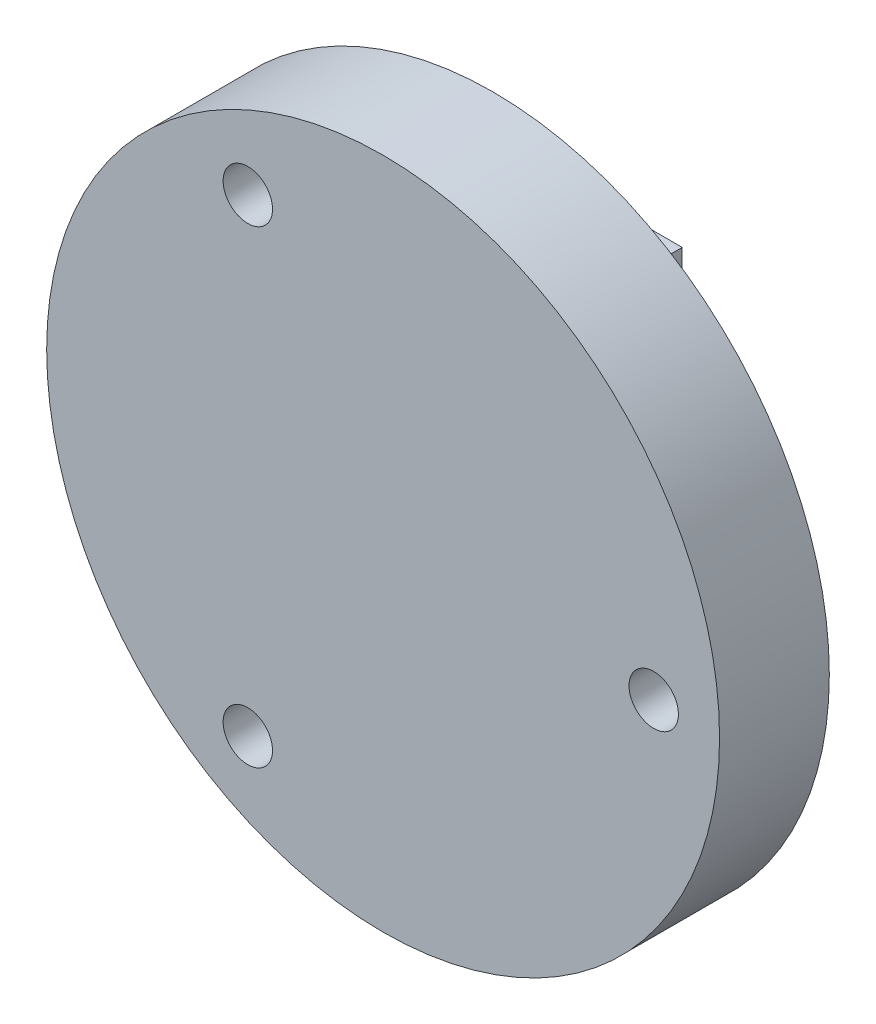
ISO-10303-21;
HEADER;
FILE_DESCRIPTION(('STEP AP214'),'2;1');
FILE_NAME('part.step','',(''),(''),'','','');
FILE_SCHEMA(('AUTOMOTIVE_DESIGN { 1 0 10303 214 1 1 1 1 }'));
ENDSEC;
DATA;
#1=APPLICATION_CONTEXT('core data for automotive mechanical design processes');
#2=APPLICATION_PROTOCOL_DEFINITION('international standard','automotive_design',2000,#1);
#3=PRODUCT_CONTEXT('',#1,'mechanical');
#4=PRODUCT('Part','Part','',(#3));
#5=PRODUCT_RELATED_PRODUCT_CATEGORY('part','',(#4));
#6=PRODUCT_DEFINITION_FORMATION('','',#4);
#7=PRODUCT_DEFINITION_CONTEXT('part definition',#1,'design');
#8=PRODUCT_DEFINITION('design','',#6,#7);
#9=PRODUCT_DEFINITION_SHAPE('','',#8);
#10=(LENGTH_UNIT() NAMED_UNIT(*) SI_UNIT(.MILLI.,.METRE.));
#11=(NAMED_UNIT(*) PLANE_ANGLE_UNIT() SI_UNIT($,.RADIAN.));
#12=(NAMED_UNIT(*) SI_UNIT($,.STERADIAN.) SOLID_ANGLE_UNIT());
#13=UNCERTAINTY_MEASURE_WITH_UNIT(LENGTH_MEASURE(1.E-05),#10,'distance_accuracy_value','');
#14=(GEOMETRIC_REPRESENTATION_CONTEXT(3) GLOBAL_UNCERTAINTY_ASSIGNED_CONTEXT((#13)) GLOBAL_UNIT_ASSIGNED_CONTEXT((#10,
#11,#12)) REPRESENTATION_CONTEXT('',''));
#15=CARTESIAN_POINT('',(0.,0.,0.));
#16=DIRECTION('',(0.,0.,1.));
#17=DIRECTION('',(1.,0.,0.));
#18=AXIS2_PLACEMENT_3D('',#15,#16,#17);
#19=CARTESIAN_POINT('',(-5.25,0.,-12.));
#20=DIRECTION('',(1.,0.,0.));
#21=DIRECTION('',(0.,0.,-1.));
#22=AXIS2_PLACEMENT_3D('',#19,#20,#21);
#23=PLANE('',#22);
#24=DIRECTION('',(0.,1.,0.));
#25=VECTOR('',#24,1.);
#26=CARTESIAN_POINT('',(-5.25,0.,0.));
#27=LINE('',#26,#25);
#28=CARTESIAN_POINT('',(-5.25,-15.,0.));
#29=VERTEX_POINT('',#28);
#30=CARTESIAN_POINT('',(-5.25,15.,0.));
#31=VERTEX_POINT('',#30);
#32=EDGE_CURVE('E108',#29,#31,#27,.T.);
#33=ORIENTED_EDGE('',*,*,#32,.T.);
#34=DIRECTION('',(0.,0.,1.));
#35=VECTOR('',#34,1.);
#36=CARTESIAN_POINT('',(-5.25,15.,-12.));
#37=LINE('',#36,#35);
#38=CARTESIAN_POINT('',(-5.25,15.,-12.));
#39=VERTEX_POINT('',#38);
#40=EDGE_CURVE('E98',#39,#31,#37,.T.);
#41=ORIENTED_EDGE('',*,*,#40,.F.);
#42=DIRECTION('',(0.,1.,0.));
#43=VECTOR('',#42,1.);
#44=CARTESIAN_POINT('',(-5.25,0.,-12.));
#45=LINE('',#44,#43);
#46=CARTESIAN_POINT('',(-5.25,-15.,-12.));
#47=VERTEX_POINT('',#46);
#48=EDGE_CURVE('E80',#47,#39,#45,.T.);
#49=ORIENTED_EDGE('',*,*,#48,.F.);
#50=DIRECTION('',(0.,0.,1.));
#51=VECTOR('',#50,1.);
#52=CARTESIAN_POINT('',(-5.25,-15.,-12.));
#53=LINE('',#52,#51);
#54=EDGE_CURVE('E89',#47,#29,#53,.T.);
#55=ORIENTED_EDGE('',*,*,#54,.T.);
#56=EDGE_LOOP('',(#33,#41,#49,#55));
#57=FACE_BOUND('',#56,.T.);
#58=CARTESIAN_POINT('',(-5.25,-7.5,-5.));
#59=DIRECTION('',(-1.,0.,0.));
#60=DIRECTION('',(0.,0.,1.));
#61=AXIS2_PLACEMENT_3D('',#58,#59,#60);
#62=CIRCLE('',#61,2.15);
#63=CARTESIAN_POINT('',(-5.25,-7.5,-2.85));
#64=VERTEX_POINT('',#63);
#65=EDGE_CURVE('E346',#64,#64,#62,.F.);
#66=ORIENTED_EDGE('',*,*,#65,.T.);
#67=EDGE_LOOP('',(#66));
#68=FACE_BOUND('',#67,.T.);
#69=CARTESIAN_POINT('',(-5.25,7.5,-5.));
#70=DIRECTION('',(-1.,0.,0.));
#71=DIRECTION('',(0.,0.,1.));
#72=AXIS2_PLACEMENT_3D('',#69,#70,#71);
#73=CIRCLE('',#72,2.15);
#74=CARTESIAN_POINT('',(-5.25,7.5,-2.85));
#75=VERTEX_POINT('',#74);
#76=EDGE_CURVE('E110',#75,#75,#73,.T.);
#77=ORIENTED_EDGE('',*,*,#76,.F.);
#78=EDGE_LOOP('',(#77));
#79=FACE_BOUND('',#78,.T.);
#80=ADVANCED_FACE('F34',(#57,#68,#79),#23,.F.);
#81=CARTESIAN_POINT('',(5.25,0.,-12.));
#82=DIRECTION('',(1.,0.,0.));
#83=DIRECTION('',(0.,0.,-1.));
#84=AXIS2_PLACEMENT_3D('',#81,#82,#83);
#85=PLANE('',#84);
#86=CARTESIAN_POINT('',(5.25,-7.5,-5.));
#87=DIRECTION('',(1.,0.,0.));
#88=DIRECTION('',(0.,0.,-1.));
#89=AXIS2_PLACEMENT_3D('',#86,#87,#88);
#90=CIRCLE('',#89,2.15);
#91=CARTESIAN_POINT('',(5.25,-7.5,-7.15));
#92=VERTEX_POINT('',#91);
#93=EDGE_CURVE('E103',#92,#92,#90,.T.);
#94=ORIENTED_EDGE('',*,*,#93,.F.);
#95=EDGE_LOOP('',(#94));
#96=FACE_BOUND('',#95,.T.);
#97=DIRECTION('',(0.,1.,0.));
#98=VECTOR('',#97,1.);
#99=CARTESIAN_POINT('',(5.25,0.,0.));
#100=LINE('',#99,#98);
#101=CARTESIAN_POINT('',(5.25,-15.,0.));
#102=VERTEX_POINT('',#101);
#103=CARTESIAN_POINT('',(5.25,15.,0.));
#104=VERTEX_POINT('',#103);
#105=EDGE_CURVE('E55',#102,#104,#100,.T.);
#106=ORIENTED_EDGE('',*,*,#105,.F.);
#107=DIRECTION('',(0.,0.,1.));
#108=VECTOR('',#107,1.);
#109=CARTESIAN_POINT('',(5.25,-15.,-12.));
#110=LINE('',#109,#108);
#111=CARTESIAN_POINT('',(5.25,-15.,-12.));
#112=VERTEX_POINT('',#111);
#113=EDGE_CURVE('E94',#112,#102,#110,.T.);
#114=ORIENTED_EDGE('',*,*,#113,.F.);
#115=DIRECTION('',(0.,1.,0.));
#116=VECTOR('',#115,1.);
#117=CARTESIAN_POINT('',(5.25,0.,-12.));
#118=LINE('',#117,#116);
#119=CARTESIAN_POINT('',(5.25,15.,-12.));
#120=VERTEX_POINT('',#119);
#121=EDGE_CURVE('E83',#112,#120,#118,.T.);
#122=ORIENTED_EDGE('',*,*,#121,.T.);
#123=DIRECTION('',(0.,0.,1.));
#124=VECTOR('',#123,1.);
#125=CARTESIAN_POINT('',(5.25,15.,-12.));
#126=LINE('',#125,#124);
#127=EDGE_CURVE('E115',#120,#104,#126,.T.);
#128=ORIENTED_EDGE('',*,*,#127,.T.);
#129=EDGE_LOOP('',(#106,#114,#122,#128));
#130=FACE_BOUND('',#129,.T.);
#131=CARTESIAN_POINT('',(5.25,7.5,-5.));
#132=DIRECTION('',(1.,0.,0.));
#133=DIRECTION('',(0.,0.,-1.));
#134=AXIS2_PLACEMENT_3D('',#131,#132,#133);
#135=CIRCLE('',#134,2.15);
#136=CARTESIAN_POINT('',(5.25,7.5,-7.15));
#137=VERTEX_POINT('',#136);
#138=EDGE_CURVE('E340',#137,#137,#135,.F.);
#139=ORIENTED_EDGE('',*,*,#138,.T.);
#140=EDGE_LOOP('',(#139));
#141=FACE_BOUND('',#140,.T.);
#142=ADVANCED_FACE('F173',(#96,#130,#141),#85,.T.);
#143=CARTESIAN_POINT('',(0.,0.,0.));
#144=DIRECTION('',(0.,0.,1.));
#145=DIRECTION('',(1.,0.,0.));
#146=AXIS2_PLACEMENT_3D('',#143,#144,#145);
#147=PLANE('',#146);
#148=CARTESIAN_POINT('',(0.,0.,0.));
#149=DIRECTION('',(0.,0.,1.));
#150=DIRECTION('',(1.,0.,0.));
#151=AXIS2_PLACEMENT_3D('',#148,#149,#150);
#152=CIRCLE('',#151,30.65);
#153=CARTESIAN_POINT('',(30.65,0.,0.));
#154=VERTEX_POINT('',#153);
#155=EDGE_CURVE('E38',#154,#154,#152,.T.);
#156=ORIENTED_EDGE('',*,*,#155,.F.);
#157=EDGE_LOOP('',(#156));
#158=FACE_BOUND('',#157,.T.);
#159=CARTESIAN_POINT('',(-12.325,-21.3475262032864,0.));
#160=DIRECTION('',(0.,0.,1.));
#161=DIRECTION('',(1.,0.,0.));
#162=AXIS2_PLACEMENT_3D('',#159,#160,#161);
#163=CIRCLE('',#162,3.54999999999999);
#164=CARTESIAN_POINT('',(-8.77500000000001,-21.3475262032864,0.));
#165=VERTEX_POINT('',#164);
#166=EDGE_CURVE('E114',#165,#165,#163,.T.);
#167=ORIENTED_EDGE('',*,*,#166,.T.);
#168=EDGE_LOOP('',(#167));
#169=FACE_BOUND('',#168,.T.);
#170=CARTESIAN_POINT('',(24.65,0.,0.));
#171=DIRECTION('',(0.,0.,1.));
#172=DIRECTION('',(1.,0.,0.));
#173=AXIS2_PLACEMENT_3D('',#170,#171,#172);
#174=CIRCLE('',#173,3.54999999999999);
#175=CARTESIAN_POINT('',(28.2,0.,0.));
#176=VERTEX_POINT('',#175);
#177=EDGE_CURVE('E131',#176,#176,#174,.T.);
#178=ORIENTED_EDGE('',*,*,#177,.T.);
#179=EDGE_LOOP('',(#178));
#180=FACE_BOUND('',#179,.T.);
#181=CARTESIAN_POINT('',(-12.325,21.3475262032864,0.));
#182=DIRECTION('',(0.,0.,1.));
#183=DIRECTION('',(1.,0.,0.));
#184=AXIS2_PLACEMENT_3D('',#181,#182,#183);
#185=CIRCLE('',#184,3.54999999999998);
#186=CARTESIAN_POINT('',(-8.77500000000003,21.3475262032864,0.));
#187=VERTEX_POINT('',#186);
#188=EDGE_CURVE('E122',#187,#187,#185,.T.);
#189=ORIENTED_EDGE('',*,*,#188,.T.);
#190=EDGE_LOOP('',(#189));
#191=FACE_BOUND('',#190,.T.);
#192=ORIENTED_EDGE('',*,*,#32,.F.);
#193=DIRECTION('',(-1.,0.,0.));
#194=VECTOR('',#193,1.);
#195=CARTESIAN_POINT('',(0.,-15.,0.));
#196=LINE('',#195,#194);
#197=EDGE_CURVE('E91',#102,#29,#196,.T.);
#198=ORIENTED_EDGE('',*,*,#197,.F.);
#199=ORIENTED_EDGE('',*,*,#105,.T.);
#200=DIRECTION('',(-1.,0.,0.));
#201=VECTOR('',#200,1.);
#202=CARTESIAN_POINT('',(0.,15.,0.));
#203=LINE('',#202,#201);
#204=EDGE_CURVE('E50',#104,#31,#203,.T.);
#205=ORIENTED_EDGE('',*,*,#204,.T.);
#206=EDGE_LOOP('',(#192,#198,#199,#205));
#207=FACE_BOUND('',#206,.T.);
#208=ADVANCED_FACE('F170',(#158,#169,#180,#191,#207),#147,.F.);
#209=CARTESIAN_POINT('',(-12.325,21.3475262032864,10.));
#210=DIRECTION('',(0.,0.,-1.));
#211=DIRECTION('',(-1.,0.,0.));
#212=AXIS2_PLACEMENT_3D('',#209,#210,#211);
#213=CYLINDRICAL_SURFACE('',#212,2.25);
#214=CARTESIAN_POINT('',(-12.325,21.3475262032864,5.));
#215=DIRECTION('',(0.,0.,1.));
#216=DIRECTION('',(1.,0.,0.));
#217=AXIS2_PLACEMENT_3D('',#214,#215,#216);
#218=CIRCLE('',#217,2.25);
#219=CARTESIAN_POINT('',(-10.075,21.3475262032864,5.));
#220=VERTEX_POINT('',#219);
#221=EDGE_CURVE('E118',#220,#220,#218,.T.);
#222=ORIENTED_EDGE('',*,*,#221,.F.);
#223=EDGE_LOOP('',(#222));
#224=FACE_BOUND('',#223,.T.);
#225=CARTESIAN_POINT('',(-12.325,21.3475262032864,10.));
#226=DIRECTION('',(0.,0.,1.));
#227=DIRECTION('',(1.,0.,0.));
#228=AXIS2_PLACEMENT_3D('',#225,#226,#227);
#229=CIRCLE('',#228,2.25);
#230=CARTESIAN_POINT('',(-10.075,21.3475262032864,10.));
#231=VERTEX_POINT('',#230);
#232=EDGE_CURVE('E43',#231,#231,#229,.T.);
#233=ORIENTED_EDGE('',*,*,#232,.T.);
#234=EDGE_LOOP('',(#233));
#235=FACE_BOUND('',#234,.T.);
#236=ADVANCED_FACE('F153',(#224,#235),#213,.F.);
#237=CARTESIAN_POINT('',(24.65,0.,10.));
#238=DIRECTION('',(0.,0.,-1.));
#239=DIRECTION('',(-1.,0.,0.));
#240=AXIS2_PLACEMENT_3D('',#237,#238,#239);
#241=CYLINDRICAL_SURFACE('',#240,2.25);
#242=CARTESIAN_POINT('',(24.65,0.,5.));
#243=DIRECTION('',(0.,0.,1.));
#244=DIRECTION('',(1.,0.,0.));
#245=AXIS2_PLACEMENT_3D('',#242,#243,#244);
#246=CIRCLE('',#245,2.25);
#247=CARTESIAN_POINT('',(26.9,0.,5.));
#248=VERTEX_POINT('',#247);
#249=EDGE_CURVE('E127',#248,#248,#246,.T.);
#250=ORIENTED_EDGE('',*,*,#249,.F.);
#251=EDGE_LOOP('',(#250));
#252=FACE_BOUND('',#251,.T.);
#253=CARTESIAN_POINT('',(24.65,0.,10.));
#254=DIRECTION('',(0.,0.,1.));
#255=DIRECTION('',(1.,0.,0.));
#256=AXIS2_PLACEMENT_3D('',#253,#254,#255);
#257=CIRCLE('',#256,2.25);
#258=CARTESIAN_POINT('',(26.9,0.,10.));
#259=VERTEX_POINT('',#258);
#260=EDGE_CURVE('E147',#259,#259,#257,.T.);
#261=ORIENTED_EDGE('',*,*,#260,.T.);
#262=EDGE_LOOP('',(#261));
#263=FACE_BOUND('',#262,.T.);
#264=ADVANCED_FACE('F223',(#252,#263),#241,.F.);
#265=CARTESIAN_POINT('',(-12.325,-21.3475262032864,10.));
#266=DIRECTION('',(0.,0.,-1.));
#267=DIRECTION('',(-1.,0.,0.));
#268=AXIS2_PLACEMENT_3D('',#265,#266,#267);
#269=CYLINDRICAL_SURFACE('',#268,2.25);
#270=CARTESIAN_POINT('',(-12.325,-21.3475262032864,5.));
#271=DIRECTION('',(0.,0.,1.));
#272=DIRECTION('',(1.,0.,0.));
#273=AXIS2_PLACEMENT_3D('',#270,#271,#272);
#274=CIRCLE('',#273,2.25);
#275=CARTESIAN_POINT('',(-10.075,-21.3475262032864,5.));
#276=VERTEX_POINT('',#275);
#277=EDGE_CURVE('E137',#276,#276,#274,.T.);
#278=ORIENTED_EDGE('',*,*,#277,.F.);
#279=EDGE_LOOP('',(#278));
#280=FACE_BOUND('',#279,.T.);
#281=CARTESIAN_POINT('',(-12.325,-21.3475262032864,10.));
#282=DIRECTION('',(0.,0.,1.));
#283=DIRECTION('',(1.,0.,0.));
#284=AXIS2_PLACEMENT_3D('',#281,#282,#283);
#285=CIRCLE('',#284,2.25);
#286=CARTESIAN_POINT('',(-10.075,-21.3475262032864,10.));
#287=VERTEX_POINT('',#286);
#288=EDGE_CURVE('E144',#287,#287,#285,.T.);
#289=ORIENTED_EDGE('',*,*,#288,.T.);
#290=EDGE_LOOP('',(#289));
#291=FACE_BOUND('',#290,.T.);
#292=ADVANCED_FACE('F36',(#280,#291),#269,.F.);
#293=CARTESIAN_POINT('',(0.,0.,10.));
#294=DIRECTION('',(0.,0.,-1.));
#295=DIRECTION('',(-1.,0.,0.));
#296=AXIS2_PLACEMENT_3D('',#293,#294,#295);
#297=CYLINDRICAL_SURFACE('',#296,30.65);
#298=CARTESIAN_POINT('',(0.,0.,10.));
#299=DIRECTION('',(0.,0.,1.));
#300=DIRECTION('',(1.,0.,0.));
#301=AXIS2_PLACEMENT_3D('',#298,#299,#300);
#302=CIRCLE('',#301,30.65);
#303=CARTESIAN_POINT('',(30.65,0.,10.));
#304=VERTEX_POINT('',#303);
#305=EDGE_CURVE('E11',#304,#304,#302,.T.);
#306=ORIENTED_EDGE('',*,*,#305,.F.);
#307=EDGE_LOOP('',(#306));
#308=FACE_BOUND('',#307,.T.);
#309=ORIENTED_EDGE('',*,*,#155,.T.);
#310=EDGE_LOOP('',(#309));
#311=FACE_BOUND('',#310,.T.);
#312=ADVANCED_FACE('F159',(#308,#311),#297,.T.);
#313=CARTESIAN_POINT('',(0.,0.,10.));
#314=DIRECTION('',(0.,0.,1.));
#315=DIRECTION('',(1.,0.,0.));
#316=AXIS2_PLACEMENT_3D('',#313,#314,#315);
#317=PLANE('',#316);
#318=ORIENTED_EDGE('',*,*,#288,.F.);
#319=EDGE_LOOP('',(#318));
#320=FACE_BOUND('',#319,.T.);
#321=ORIENTED_EDGE('',*,*,#260,.F.);
#322=EDGE_LOOP('',(#321));
#323=FACE_BOUND('',#322,.T.);
#324=ORIENTED_EDGE('',*,*,#232,.F.);
#325=EDGE_LOOP('',(#324));
#326=FACE_BOUND('',#325,.T.);
#327=ORIENTED_EDGE('',*,*,#305,.T.);
#328=EDGE_LOOP('',(#327));
#329=FACE_BOUND('',#328,.T.);
#330=ADVANCED_FACE('F155',(#320,#323,#326,#329),#317,.T.);
#331=CARTESIAN_POINT('',(-12.325,-21.3475262032864,5.));
#332=DIRECTION('',(0.,0.,-1.));
#333=DIRECTION('',(-1.,0.,0.));
#334=AXIS2_PLACEMENT_3D('',#331,#332,#333);
#335=CYLINDRICAL_SURFACE('',#334,3.54999999999999);
#336=CARTESIAN_POINT('',(-12.325,-21.3475262032864,5.));
#337=DIRECTION('',(0.,0.,1.));
#338=DIRECTION('',(1.,0.,0.));
#339=AXIS2_PLACEMENT_3D('',#336,#337,#338);
#340=CIRCLE('',#339,3.54999999999999);
#341=CARTESIAN_POINT('',(-8.77500000000001,-21.3475262032864,5.));
#342=VERTEX_POINT('',#341);
#343=EDGE_CURVE('E136',#342,#342,#340,.T.);
#344=ORIENTED_EDGE('',*,*,#343,.T.);
#345=EDGE_LOOP('',(#344));
#346=FACE_BOUND('',#345,.T.);
#347=ORIENTED_EDGE('',*,*,#166,.F.);
#348=EDGE_LOOP('',(#347));
#349=FACE_BOUND('',#348,.T.);
#350=ADVANCED_FACE('F158',(#346,#349),#335,.F.);
#351=CARTESIAN_POINT('',(0.,0.,5.));
#352=DIRECTION('',(0.,0.,1.));
#353=DIRECTION('',(1.,0.,0.));
#354=AXIS2_PLACEMENT_3D('',#351,#352,#353);
#355=PLANE('',#354);
#356=ORIENTED_EDGE('',*,*,#277,.T.);
#357=EDGE_LOOP('',(#356));
#358=FACE_BOUND('',#357,.T.);
#359=ORIENTED_EDGE('',*,*,#343,.F.);
#360=EDGE_LOOP('',(#359));
#361=FACE_BOUND('',#360,.T.);
#362=ADVANCED_FACE('F214',(#358,#361),#355,.F.);
#363=CARTESIAN_POINT('',(24.65,0.,5.));
#364=DIRECTION('',(0.,0.,-1.));
#365=DIRECTION('',(-1.,0.,0.));
#366=AXIS2_PLACEMENT_3D('',#363,#364,#365);
#367=CYLINDRICAL_SURFACE('',#366,3.54999999999999);
#368=CARTESIAN_POINT('',(24.65,0.,5.));
#369=DIRECTION('',(0.,0.,1.));
#370=DIRECTION('',(1.,0.,0.));
#371=AXIS2_PLACEMENT_3D('',#368,#369,#370);
#372=CIRCLE('',#371,3.54999999999999);
#373=CARTESIAN_POINT('',(28.2,0.,5.));
#374=VERTEX_POINT('',#373);
#375=EDGE_CURVE('E128',#374,#374,#372,.T.);
#376=ORIENTED_EDGE('',*,*,#375,.T.);
#377=EDGE_LOOP('',(#376));
#378=FACE_BOUND('',#377,.T.);
#379=ORIENTED_EDGE('',*,*,#177,.F.);
#380=EDGE_LOOP('',(#379));
#381=FACE_BOUND('',#380,.T.);
#382=ADVANCED_FACE('F210',(#378,#381),#367,.F.);
#383=CARTESIAN_POINT('',(0.,0.,5.));
#384=DIRECTION('',(0.,0.,1.));
#385=DIRECTION('',(1.,0.,0.));
#386=AXIS2_PLACEMENT_3D('',#383,#384,#385);
#387=PLANE('',#386);
#388=ORIENTED_EDGE('',*,*,#375,.F.);
#389=EDGE_LOOP('',(#388));
#390=FACE_BOUND('',#389,.T.);
#391=ORIENTED_EDGE('',*,*,#249,.T.);
#392=EDGE_LOOP('',(#391));
#393=FACE_BOUND('',#392,.T.);
#394=ADVANCED_FACE('F206',(#390,#393),#387,.F.);
#395=CARTESIAN_POINT('',(-12.325,21.3475262032864,5.));
#396=DIRECTION('',(0.,0.,-1.));
#397=DIRECTION('',(-1.,0.,0.));
#398=AXIS2_PLACEMENT_3D('',#395,#396,#397);
#399=CYLINDRICAL_SURFACE('',#398,3.54999999999998);
#400=CARTESIAN_POINT('',(-12.325,21.3475262032864,5.));
#401=DIRECTION('',(0.,0.,1.));
#402=DIRECTION('',(1.,0.,0.));
#403=AXIS2_PLACEMENT_3D('',#400,#401,#402);
#404=CIRCLE('',#403,3.54999999999998);
#405=CARTESIAN_POINT('',(-8.77500000000003,21.3475262032864,5.));
#406=VERTEX_POINT('',#405);
#407=EDGE_CURVE('E121',#406,#406,#404,.T.);
#408=ORIENTED_EDGE('',*,*,#407,.T.);
#409=EDGE_LOOP('',(#408));
#410=FACE_BOUND('',#409,.T.);
#411=ORIENTED_EDGE('',*,*,#188,.F.);
#412=EDGE_LOOP('',(#411));
#413=FACE_BOUND('',#412,.T.);
#414=ADVANCED_FACE('F192',(#410,#413),#399,.F.);
#415=CARTESIAN_POINT('',(0.,0.,5.));
#416=DIRECTION('',(0.,0.,1.));
#417=DIRECTION('',(1.,0.,0.));
#418=AXIS2_PLACEMENT_3D('',#415,#416,#417);
#419=PLANE('',#418);
#420=ORIENTED_EDGE('',*,*,#221,.T.);
#421=EDGE_LOOP('',(#420));
#422=FACE_BOUND('',#421,.T.);
#423=ORIENTED_EDGE('',*,*,#407,.F.);
#424=EDGE_LOOP('',(#423));
#425=FACE_BOUND('',#424,.T.);
#426=ADVANCED_FACE('F185',(#422,#425),#419,.F.);
#427=CARTESIAN_POINT('',(0.,15.,-12.));
#428=DIRECTION('',(0.,1.,0.));
#429=DIRECTION('',(0.,0.,1.));
#430=AXIS2_PLACEMENT_3D('',#427,#428,#429);
#431=PLANE('',#430);
#432=ORIENTED_EDGE('',*,*,#204,.F.);
#433=ORIENTED_EDGE('',*,*,#127,.F.);
#434=DIRECTION('',(-1.,0.,0.));
#435=VECTOR('',#434,1.);
#436=CARTESIAN_POINT('',(0.,15.,-12.));
#437=LINE('',#436,#435);
#438=EDGE_CURVE('E95',#120,#39,#437,.T.);
#439=ORIENTED_EDGE('',*,*,#438,.T.);
#440=ORIENTED_EDGE('',*,*,#40,.T.);
#441=EDGE_LOOP('',(#432,#433,#439,#440));
#442=FACE_BOUND('',#441,.T.);
#443=ADVANCED_FACE('F183',(#442),#431,.T.);
#444=CARTESIAN_POINT('',(0.,-15.,-12.));
#445=DIRECTION('',(0.,1.,0.));
#446=DIRECTION('',(0.,0.,1.));
#447=AXIS2_PLACEMENT_3D('',#444,#445,#446);
#448=PLANE('',#447);
#449=ORIENTED_EDGE('',*,*,#197,.T.);
#450=ORIENTED_EDGE('',*,*,#54,.F.);
#451=DIRECTION('',(-1.,0.,0.));
#452=VECTOR('',#451,1.);
#453=CARTESIAN_POINT('',(0.,-15.,-12.));
#454=LINE('',#453,#452);
#455=EDGE_CURVE('E75',#112,#47,#454,.T.);
#456=ORIENTED_EDGE('',*,*,#455,.F.);
#457=ORIENTED_EDGE('',*,*,#113,.T.);
#458=EDGE_LOOP('',(#449,#450,#456,#457));
#459=FACE_BOUND('',#458,.T.);
#460=ADVANCED_FACE('F90',(#459),#448,.F.);
#461=CARTESIAN_POINT('',(0.,0.,-12.));
#462=DIRECTION('',(0.,0.,1.));
#463=DIRECTION('',(1.,0.,0.));
#464=AXIS2_PLACEMENT_3D('',#461,#462,#463);
#465=PLANE('',#464);
#466=ORIENTED_EDGE('',*,*,#48,.T.);
#467=ORIENTED_EDGE('',*,*,#438,.F.);
#468=ORIENTED_EDGE('',*,*,#121,.F.);
#469=ORIENTED_EDGE('',*,*,#455,.T.);
#470=EDGE_LOOP('',(#466,#467,#468,#469));
#471=FACE_BOUND('',#470,.T.);
#472=ADVANCED_FACE('F77',(#471),#465,.F.);
#473=CARTESIAN_POINT('',(30.651,-7.5,-5.));
#474=DIRECTION('',(-1.,0.,0.));
#475=DIRECTION('',(0.,0.,1.));
#476=AXIS2_PLACEMENT_3D('',#473,#474,#475);
#477=CYLINDRICAL_SURFACE('',#476,2.15);
#478=ORIENTED_EDGE('',*,*,#93,.T.);
#479=EDGE_LOOP('',(#478));
#480=FACE_BOUND('',#479,.T.);
#481=ORIENTED_EDGE('',*,*,#65,.F.);
#482=EDGE_LOOP('',(#481));
#483=FACE_BOUND('',#482,.T.);
#484=ADVANCED_FACE('F304',(#480,#483),#477,.F.);
#485=CARTESIAN_POINT('',(30.651,7.5,-5.));
#486=DIRECTION('',(-1.,0.,0.));
#487=DIRECTION('',(0.,0.,1.));
#488=AXIS2_PLACEMENT_3D('',#485,#486,#487);
#489=CYLINDRICAL_SURFACE('',#488,2.15);
#490=ORIENTED_EDGE('',*,*,#138,.F.);
#491=EDGE_LOOP('',(#490));
#492=FACE_BOUND('',#491,.T.);
#493=ORIENTED_EDGE('',*,*,#76,.T.);
#494=EDGE_LOOP('',(#493));
#495=FACE_BOUND('',#494,.T.);
#496=ADVANCED_FACE('F323',(#492,#495),#489,.F.);
#497=CLOSED_SHELL('',(#80,#142,#208,#236,#264,#292,#312,#330,#350,#362,#382,#394,#414,#426,#443,
#460,#472,#484,#496));
#498=MANIFOLD_SOLID_BREP('B2',#497);
#499=ADVANCED_BREP_SHAPE_REPRESENTATION('',(#18,#498),#14);
#500=SHAPE_DEFINITION_REPRESENTATION(#9,#499);
ENDSEC;
END-ISO-10303-21;
